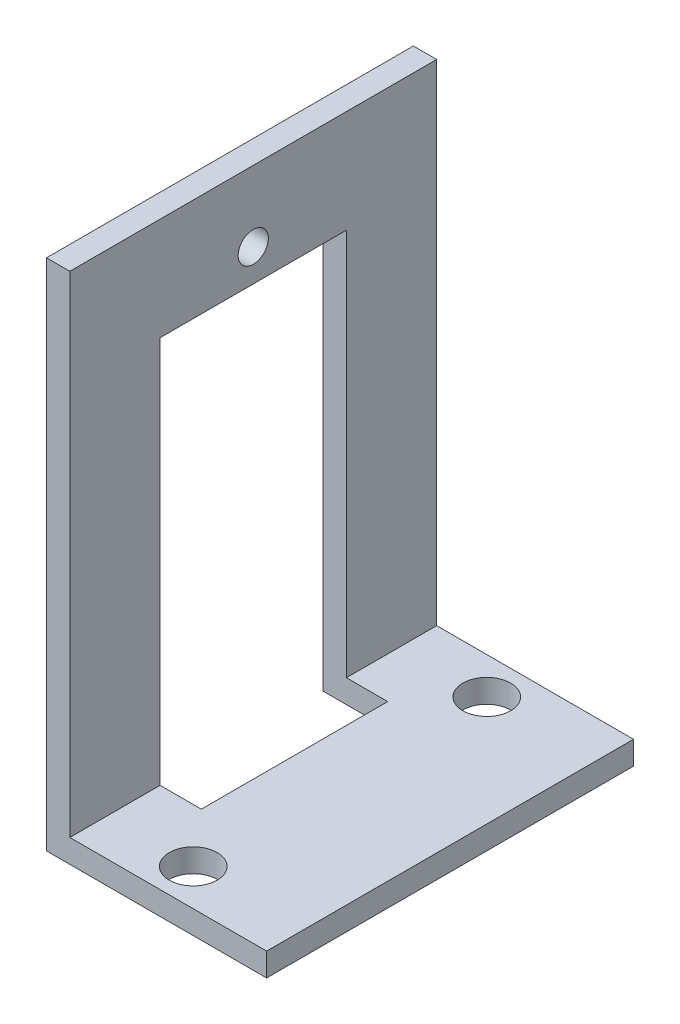
ISO-10303-21;
HEADER;
FILE_DESCRIPTION(('STEP AP214'),'2;1');
FILE_NAME('part.step','',(''),(''),'','','');
FILE_SCHEMA(('AUTOMOTIVE_DESIGN { 1 0 10303 214 1 1 1 1 }'));
ENDSEC;
DATA;
#1=APPLICATION_CONTEXT('core data for automotive mechanical design processes');
#2=APPLICATION_PROTOCOL_DEFINITION('international standard','automotive_design',2000,#1);
#3=PRODUCT_CONTEXT('',#1,'mechanical');
#4=PRODUCT('Part','Part','',(#3));
#5=PRODUCT_RELATED_PRODUCT_CATEGORY('part','',(#4));
#6=PRODUCT_DEFINITION_FORMATION('','',#4);
#7=PRODUCT_DEFINITION_CONTEXT('part definition',#1,'design');
#8=PRODUCT_DEFINITION('design','',#6,#7);
#9=PRODUCT_DEFINITION_SHAPE('','',#8);
#10=(LENGTH_UNIT() NAMED_UNIT(*) SI_UNIT(.MILLI.,.METRE.));
#11=(NAMED_UNIT(*) PLANE_ANGLE_UNIT() SI_UNIT($,.RADIAN.));
#12=(NAMED_UNIT(*) SI_UNIT($,.STERADIAN.) SOLID_ANGLE_UNIT());
#13=UNCERTAINTY_MEASURE_WITH_UNIT(LENGTH_MEASURE(1.E-05),#10,'distance_accuracy_value','');
#14=(GEOMETRIC_REPRESENTATION_CONTEXT(3) GLOBAL_UNCERTAINTY_ASSIGNED_CONTEXT((#13)) GLOBAL_UNIT_ASSIGNED_CONTEXT((#10,
#11,#12)) REPRESENTATION_CONTEXT('',''));
#15=CARTESIAN_POINT('',(0.,0.,0.));
#16=DIRECTION('',(0.,0.,1.));
#17=DIRECTION('',(1.,0.,0.));
#18=AXIS2_PLACEMENT_3D('',#15,#16,#17);
#19=CARTESIAN_POINT('',(15.,1.5875,12.5));
#20=DIRECTION('',(-1.,0.,0.));
#21=DIRECTION('',(0.,0.,1.));
#22=AXIS2_PLACEMENT_3D('',#19,#20,#21);
#23=PLANE('',#22);
#24=DIRECTION('',(0.,1.,0.));
#25=VECTOR('',#24,1.);
#26=CARTESIAN_POINT('',(15.,1.5875,-12.5));
#27=LINE('',#26,#25);
#28=CARTESIAN_POINT('',(15.,0.,-12.5));
#29=VERTEX_POINT('',#28);
#30=CARTESIAN_POINT('',(15.,1.5875,-12.5));
#31=VERTEX_POINT('',#30);
#32=EDGE_CURVE('E179',#29,#31,#27,.T.);
#33=ORIENTED_EDGE('',*,*,#32,.T.);
#34=DIRECTION('',(0.,0.,-1.));
#35=VECTOR('',#34,1.);
#36=CARTESIAN_POINT('',(15.,1.5875,12.5));
#37=LINE('',#36,#35);
#38=CARTESIAN_POINT('',(15.,1.5875,12.5));
#39=VERTEX_POINT('',#38);
#40=EDGE_CURVE('E11',#39,#31,#37,.T.);
#41=ORIENTED_EDGE('',*,*,#40,.F.);
#42=DIRECTION('',(0.,1.,0.));
#43=VECTOR('',#42,1.);
#44=CARTESIAN_POINT('',(15.,1.5875,12.5));
#45=LINE('',#44,#43);
#46=CARTESIAN_POINT('',(15.,0.,12.5));
#47=VERTEX_POINT('',#46);
#48=EDGE_CURVE('E182',#47,#39,#45,.T.);
#49=ORIENTED_EDGE('',*,*,#48,.F.);
#50=DIRECTION('',(0.,0.,-1.));
#51=VECTOR('',#50,1.);
#52=CARTESIAN_POINT('',(15.,0.,12.5));
#53=LINE('',#52,#51);
#54=EDGE_CURVE('E196',#47,#29,#53,.T.);
#55=ORIENTED_EDGE('',*,*,#54,.T.);
#56=EDGE_LOOP('',(#33,#41,#49,#55));
#57=FACE_BOUND('',#56,.T.);
#58=ADVANCED_FACE('F33',(#57),#23,.F.);
#59=CARTESIAN_POINT('',(15.,1.5875,12.5));
#60=DIRECTION('',(0.,-1.,0.));
#61=DIRECTION('',(0.,0.,-1.));
#62=AXIS2_PLACEMENT_3D('',#59,#60,#61);
#63=PLANE('',#62);
#64=DIRECTION('',(0.,0.,-1.));
#65=VECTOR('',#64,1.);
#66=CARTESIAN_POINT('',(1.5875,1.5875,12.5));
#67=LINE('',#66,#65);
#68=CARTESIAN_POINT('',(1.5875,1.5875,-6.35));
#69=VERTEX_POINT('',#68);
#70=CARTESIAN_POINT('',(1.5875,1.5875,-12.5));
#71=VERTEX_POINT('',#70);
#72=EDGE_CURVE('E219',#69,#71,#67,.T.);
#73=ORIENTED_EDGE('',*,*,#72,.F.);
#74=DIRECTION('',(1.,0.,0.));
#75=VECTOR('',#74,1.);
#76=CARTESIAN_POINT('',(15.,1.5875,-6.35));
#77=LINE('',#76,#75);
#78=CARTESIAN_POINT('',(4.4,1.5875,-6.35));
#79=VERTEX_POINT('',#78);
#80=EDGE_CURVE('E157',#69,#79,#77,.T.);
#81=ORIENTED_EDGE('',*,*,#80,.T.);
#82=DIRECTION('',(0.,0.,1.));
#83=VECTOR('',#82,1.);
#84=CARTESIAN_POINT('',(4.4,1.5875,12.5));
#85=LINE('',#84,#83);
#86=CARTESIAN_POINT('',(4.4,1.5875,6.35));
#87=VERTEX_POINT('',#86);
#88=EDGE_CURVE('E148',#79,#87,#85,.T.);
#89=ORIENTED_EDGE('',*,*,#88,.T.);
#90=DIRECTION('',(-1.,0.,0.));
#91=VECTOR('',#90,1.);
#92=CARTESIAN_POINT('',(15.,1.5875,6.35));
#93=LINE('',#92,#91);
#94=CARTESIAN_POINT('',(1.5875,1.5875,6.35));
#95=VERTEX_POINT('',#94);
#96=EDGE_CURVE('E127',#87,#95,#93,.T.);
#97=ORIENTED_EDGE('',*,*,#96,.T.);
#98=CARTESIAN_POINT('',(1.5875,1.5875,12.5));
#99=VERTEX_POINT('',#98);
#100=EDGE_CURVE('E40',#99,#95,#67,.T.);
#101=ORIENTED_EDGE('',*,*,#100,.F.);
#102=DIRECTION('',(-1.,0.,0.));
#103=VECTOR('',#102,1.);
#104=CARTESIAN_POINT('',(15.,1.5875,12.5));
#105=LINE('',#104,#103);
#106=EDGE_CURVE('E185',#39,#99,#105,.T.);
#107=ORIENTED_EDGE('',*,*,#106,.F.);
#108=ORIENTED_EDGE('',*,*,#40,.T.);
#109=DIRECTION('',(-1.,0.,0.));
#110=VECTOR('',#109,1.);
#111=CARTESIAN_POINT('',(15.,1.5875,-12.5));
#112=LINE('',#111,#110);
#113=EDGE_CURVE('E199',#31,#71,#112,.T.);
#114=ORIENTED_EDGE('',*,*,#113,.T.);
#115=EDGE_LOOP('',(#73,#81,#89,#97,#101,#107,#108,#114));
#116=FACE_BOUND('',#115,.T.);
#117=CARTESIAN_POINT('',(7.5,1.5875,-10.));
#118=DIRECTION('',(0.,-1.,0.));
#119=DIRECTION('',(0.,0.,-1.));
#120=AXIS2_PLACEMENT_3D('',#117,#118,#119);
#121=CIRCLE('',#120,1.63194999999999);
#122=CARTESIAN_POINT('',(7.5,1.5875,-11.63195));
#123=VERTEX_POINT('',#122);
#124=EDGE_CURVE('E170',#123,#123,#121,.F.);
#125=ORIENTED_EDGE('',*,*,#124,.F.);
#126=EDGE_LOOP('',(#125));
#127=FACE_BOUND('',#126,.T.);
#128=CARTESIAN_POINT('',(7.5,1.5875,10.));
#129=DIRECTION('',(0.,-1.,0.));
#130=DIRECTION('',(0.,0.,-1.));
#131=AXIS2_PLACEMENT_3D('',#128,#129,#130);
#132=CIRCLE('',#131,1.63194999999999);
#133=CARTESIAN_POINT('',(7.5,1.5875,8.36805000000001));
#134=VERTEX_POINT('',#133);
#135=EDGE_CURVE('E176',#134,#134,#132,.F.);
#136=ORIENTED_EDGE('',*,*,#135,.F.);
#137=EDGE_LOOP('',(#136));
#138=FACE_BOUND('',#137,.T.);
#139=ADVANCED_FACE('F229',(#116,#127,#138),#63,.F.);
#140=CARTESIAN_POINT('',(1.5875,1.5875,12.5));
#141=DIRECTION('',(-1.,0.,0.));
#142=DIRECTION('',(0.,0.,1.));
#143=AXIS2_PLACEMENT_3D('',#140,#141,#142);
#144=PLANE('',#143);
#145=CARTESIAN_POINT('',(1.5875,30.19,0.));
#146=DIRECTION('',(-1.,0.,0.));
#147=DIRECTION('',(0.,0.,1.));
#148=AXIS2_PLACEMENT_3D('',#145,#146,#147);
#149=CIRCLE('',#148,1.0287);
#150=CARTESIAN_POINT('',(1.5875,30.19,1.0287));
#151=VERTEX_POINT('',#150);
#152=EDGE_CURVE('E164',#151,#151,#149,.F.);
#153=ORIENTED_EDGE('',*,*,#152,.F.);
#154=EDGE_LOOP('',(#153));
#155=FACE_BOUND('',#154,.T.);
#156=DIRECTION('',(0.,0.,-1.));
#157=VECTOR('',#156,1.);
#158=CARTESIAN_POINT('',(1.5875,28.,12.5));
#159=LINE('',#158,#157);
#160=CARTESIAN_POINT('',(1.5875,28.,6.35));
#161=VERTEX_POINT('',#160);
#162=CARTESIAN_POINT('',(1.5875,28.,-6.35));
#163=VERTEX_POINT('',#162);
#164=EDGE_CURVE('E160',#161,#163,#159,.T.);
#165=ORIENTED_EDGE('',*,*,#164,.T.);
#166=DIRECTION('',(0.,-1.,0.));
#167=VECTOR('',#166,1.);
#168=CARTESIAN_POINT('',(1.5875,1.5875,-6.35));
#169=LINE('',#168,#167);
#170=EDGE_CURVE('E154',#163,#69,#169,.T.);
#171=ORIENTED_EDGE('',*,*,#170,.T.);
#172=ORIENTED_EDGE('',*,*,#72,.T.);
#173=DIRECTION('',(0.,1.,0.));
#174=VECTOR('',#173,1.);
#175=CARTESIAN_POINT('',(1.5875,1.5875,-12.5));
#176=LINE('',#175,#174);
#177=CARTESIAN_POINT('',(1.5875,35.,-12.5));
#178=VERTEX_POINT('',#177);
#179=EDGE_CURVE('E202',#71,#178,#176,.T.);
#180=ORIENTED_EDGE('',*,*,#179,.T.);
#181=DIRECTION('',(0.,0.,-1.));
#182=VECTOR('',#181,1.);
#183=CARTESIAN_POINT('',(1.5875,35.,12.5));
#184=LINE('',#183,#182);
#185=CARTESIAN_POINT('',(1.5875,35.,12.5));
#186=VERTEX_POINT('',#185);
#187=EDGE_CURVE('E217',#186,#178,#184,.T.);
#188=ORIENTED_EDGE('',*,*,#187,.F.);
#189=DIRECTION('',(0.,1.,0.));
#190=VECTOR('',#189,1.);
#191=CARTESIAN_POINT('',(1.5875,1.5875,12.5));
#192=LINE('',#191,#190);
#193=EDGE_CURVE('E188',#99,#186,#192,.T.);
#194=ORIENTED_EDGE('',*,*,#193,.F.);
#195=ORIENTED_EDGE('',*,*,#100,.T.);
#196=DIRECTION('',(0.,1.,0.));
#197=VECTOR('',#196,1.);
#198=CARTESIAN_POINT('',(1.5875,1.5875,6.35));
#199=LINE('',#198,#197);
#200=EDGE_CURVE('E150',#95,#161,#199,.T.);
#201=ORIENTED_EDGE('',*,*,#200,.T.);
#202=EDGE_LOOP('',(#165,#171,#172,#180,#188,#194,#195,#201));
#203=FACE_BOUND('',#202,.T.);
#204=ADVANCED_FACE('F225',(#155,#203),#144,.F.);
#205=CARTESIAN_POINT('',(0.,35.,12.5));
#206=DIRECTION('',(0.,-1.,0.));
#207=DIRECTION('',(0.,0.,-1.));
#208=AXIS2_PLACEMENT_3D('',#205,#206,#207);
#209=PLANE('',#208);
#210=DIRECTION('',(-1.,0.,0.));
#211=VECTOR('',#210,1.);
#212=CARTESIAN_POINT('',(0.,35.,-12.5));
#213=LINE('',#212,#211);
#214=CARTESIAN_POINT('',(0.,35.,-12.5));
#215=VERTEX_POINT('',#214);
#216=EDGE_CURVE('E204',#178,#215,#213,.T.);
#217=ORIENTED_EDGE('',*,*,#216,.T.);
#218=DIRECTION('',(0.,0.,-1.));
#219=VECTOR('',#218,1.);
#220=CARTESIAN_POINT('',(0.,35.,12.5));
#221=LINE('',#220,#219);
#222=CARTESIAN_POINT('',(0.,35.,12.5));
#223=VERTEX_POINT('',#222);
#224=EDGE_CURVE('E214',#223,#215,#221,.T.);
#225=ORIENTED_EDGE('',*,*,#224,.F.);
#226=DIRECTION('',(-1.,0.,0.));
#227=VECTOR('',#226,1.);
#228=CARTESIAN_POINT('',(0.,35.,12.5));
#229=LINE('',#228,#227);
#230=EDGE_CURVE('E190',#186,#223,#229,.T.);
#231=ORIENTED_EDGE('',*,*,#230,.F.);
#232=ORIENTED_EDGE('',*,*,#187,.T.);
#233=EDGE_LOOP('',(#217,#225,#231,#232));
#234=FACE_BOUND('',#233,.T.);
#235=ADVANCED_FACE('F240',(#234),#209,.F.);
#236=CARTESIAN_POINT('',(0.,0.,12.5));
#237=DIRECTION('',(1.,0.,0.));
#238=DIRECTION('',(0.,0.,-1.));
#239=AXIS2_PLACEMENT_3D('',#236,#237,#238);
#240=PLANE('',#239);
#241=CARTESIAN_POINT('',(0.,30.19,0.));
#242=DIRECTION('',(-1.,0.,0.));
#243=DIRECTION('',(0.,0.,1.));
#244=AXIS2_PLACEMENT_3D('',#241,#242,#243);
#245=CIRCLE('',#244,1.0287);
#246=CARTESIAN_POINT('',(0.,30.19,1.0287));
#247=VERTEX_POINT('',#246);
#248=EDGE_CURVE('E163',#247,#247,#245,.T.);
#249=ORIENTED_EDGE('',*,*,#248,.F.);
#250=EDGE_LOOP('',(#249));
#251=FACE_BOUND('',#250,.T.);
#252=DIRECTION('',(0.,0.,-1.));
#253=VECTOR('',#252,1.);
#254=CARTESIAN_POINT('',(0.,0.,12.5));
#255=LINE('',#254,#253);
#256=CARTESIAN_POINT('',(0.,0.,-6.35));
#257=VERTEX_POINT('',#256);
#258=CARTESIAN_POINT('',(0.,0.,-12.5));
#259=VERTEX_POINT('',#258);
#260=EDGE_CURVE('E212',#257,#259,#255,.T.);
#261=ORIENTED_EDGE('',*,*,#260,.F.);
#262=DIRECTION('',(0.,-1.,0.));
#263=VECTOR('',#262,1.);
#264=CARTESIAN_POINT('',(0.,0.,-6.35));
#265=LINE('',#264,#263);
#266=CARTESIAN_POINT('',(0.,28.,-6.35));
#267=VERTEX_POINT('',#266);
#268=EDGE_CURVE('E257',#267,#257,#265,.T.);
#269=ORIENTED_EDGE('',*,*,#268,.F.);
#270=DIRECTION('',(0.,0.,-1.));
#271=VECTOR('',#270,1.);
#272=CARTESIAN_POINT('',(0.,28.,-6.35));
#273=LINE('',#272,#271);
#274=CARTESIAN_POINT('',(0.,28.,6.35));
#275=VERTEX_POINT('',#274);
#276=EDGE_CURVE('E251',#275,#267,#273,.T.);
#277=ORIENTED_EDGE('',*,*,#276,.F.);
#278=DIRECTION('',(0.,1.,0.));
#279=VECTOR('',#278,1.);
#280=CARTESIAN_POINT('',(0.,0.,6.35));
#281=LINE('',#280,#279);
#282=CARTESIAN_POINT('',(0.,0.,6.35));
#283=VERTEX_POINT('',#282);
#284=EDGE_CURVE('E254',#283,#275,#281,.T.);
#285=ORIENTED_EDGE('',*,*,#284,.F.);
#286=CARTESIAN_POINT('',(0.,0.,12.5));
#287=VERTEX_POINT('',#286);
#288=EDGE_CURVE('E141',#287,#283,#255,.T.);
#289=ORIENTED_EDGE('',*,*,#288,.F.);
#290=DIRECTION('',(0.,-1.,0.));
#291=VECTOR('',#290,1.);
#292=CARTESIAN_POINT('',(0.,0.,12.5));
#293=LINE('',#292,#291);
#294=EDGE_CURVE('E192',#223,#287,#293,.T.);
#295=ORIENTED_EDGE('',*,*,#294,.F.);
#296=ORIENTED_EDGE('',*,*,#224,.T.);
#297=DIRECTION('',(0.,-1.,0.));
#298=VECTOR('',#297,1.);
#299=CARTESIAN_POINT('',(0.,0.,-12.5));
#300=LINE('',#299,#298);
#301=EDGE_CURVE('E206',#215,#259,#300,.T.);
#302=ORIENTED_EDGE('',*,*,#301,.T.);
#303=EDGE_LOOP('',(#261,#269,#277,#285,#289,#295,#296,#302));
#304=FACE_BOUND('',#303,.T.);
#305=ADVANCED_FACE('F245',(#251,#304),#240,.F.);
#306=CARTESIAN_POINT('',(15.,0.,12.5));
#307=DIRECTION('',(0.,1.,0.));
#308=DIRECTION('',(-1.,0.,0.));
#309=AXIS2_PLACEMENT_3D('',#306,#307,#308);
#310=PLANE('',#309);
#311=CARTESIAN_POINT('',(7.5,0.,-10.));
#312=DIRECTION('',(0.,-1.,0.));
#313=DIRECTION('',(0.,0.,-1.));
#314=AXIS2_PLACEMENT_3D('',#311,#312,#313);
#315=CIRCLE('',#314,1.63194999999999);
#316=CARTESIAN_POINT('',(7.5,0.,-11.63195));
#317=VERTEX_POINT('',#316);
#318=EDGE_CURVE('E167',#317,#317,#315,.T.);
#319=ORIENTED_EDGE('',*,*,#318,.F.);
#320=EDGE_LOOP('',(#319));
#321=FACE_BOUND('',#320,.T.);
#322=CARTESIAN_POINT('',(7.5,0.,10.));
#323=DIRECTION('',(0.,-1.,0.));
#324=DIRECTION('',(0.,0.,-1.));
#325=AXIS2_PLACEMENT_3D('',#322,#323,#324);
#326=CIRCLE('',#325,1.63194999999999);
#327=CARTESIAN_POINT('',(7.5,0.,8.36805000000001));
#328=VERTEX_POINT('',#327);
#329=EDGE_CURVE('E173',#328,#328,#326,.T.);
#330=ORIENTED_EDGE('',*,*,#329,.F.);
#331=EDGE_LOOP('',(#330));
#332=FACE_BOUND('',#331,.T.);
#333=DIRECTION('',(0.,0.,1.));
#334=VECTOR('',#333,1.);
#335=CARTESIAN_POINT('',(4.4,0.,-6.35));
#336=LINE('',#335,#334);
#337=CARTESIAN_POINT('',(4.4,0.,-6.35));
#338=VERTEX_POINT('',#337);
#339=CARTESIAN_POINT('',(4.4,0.,6.35));
#340=VERTEX_POINT('',#339);
#341=EDGE_CURVE('E130',#338,#340,#336,.T.);
#342=ORIENTED_EDGE('',*,*,#341,.F.);
#343=DIRECTION('',(-1.,0.,0.));
#344=VECTOR('',#343,1.);
#345=CARTESIAN_POINT('',(4.4,0.,-6.35));
#346=LINE('',#345,#344);
#347=EDGE_CURVE('E55',#338,#257,#346,.T.);
#348=ORIENTED_EDGE('',*,*,#347,.T.);
#349=ORIENTED_EDGE('',*,*,#260,.T.);
#350=DIRECTION('',(1.,0.,0.));
#351=VECTOR('',#350,1.);
#352=CARTESIAN_POINT('',(15.,0.,-12.5));
#353=LINE('',#352,#351);
#354=EDGE_CURVE('E186',#259,#29,#353,.T.);
#355=ORIENTED_EDGE('',*,*,#354,.T.);
#356=ORIENTED_EDGE('',*,*,#54,.F.);
#357=DIRECTION('',(1.,0.,0.));
#358=VECTOR('',#357,1.);
#359=CARTESIAN_POINT('',(15.,0.,12.5));
#360=LINE('',#359,#358);
#361=EDGE_CURVE('E194',#287,#47,#360,.T.);
#362=ORIENTED_EDGE('',*,*,#361,.F.);
#363=ORIENTED_EDGE('',*,*,#288,.T.);
#364=DIRECTION('',(-1.,0.,0.));
#365=VECTOR('',#364,1.);
#366=CARTESIAN_POINT('',(4.4,0.,6.35));
#367=LINE('',#366,#365);
#368=EDGE_CURVE('E124',#340,#283,#367,.T.);
#369=ORIENTED_EDGE('',*,*,#368,.F.);
#370=EDGE_LOOP('',(#342,#348,#349,#355,#356,#362,#363,#369));
#371=FACE_BOUND('',#370,.T.);
#372=ADVANCED_FACE('F138',(#321,#332,#371),#310,.F.);
#373=CARTESIAN_POINT('',(0.,0.,12.5));
#374=DIRECTION('',(0.,0.,-1.));
#375=DIRECTION('',(-1.,0.,0.));
#376=AXIS2_PLACEMENT_3D('',#373,#374,#375);
#377=PLANE('',#376);
#378=ORIENTED_EDGE('',*,*,#48,.T.);
#379=ORIENTED_EDGE('',*,*,#106,.T.);
#380=ORIENTED_EDGE('',*,*,#193,.T.);
#381=ORIENTED_EDGE('',*,*,#230,.T.);
#382=ORIENTED_EDGE('',*,*,#294,.T.);
#383=ORIENTED_EDGE('',*,*,#361,.T.);
#384=EDGE_LOOP('',(#378,#379,#380,#381,#382,#383));
#385=FACE_BOUND('',#384,.T.);
#386=ADVANCED_FACE('F247',(#385),#377,.F.);
#387=CARTESIAN_POINT('',(0.,0.,-12.5));
#388=DIRECTION('',(0.,0.,-1.));
#389=DIRECTION('',(-1.,0.,0.));
#390=AXIS2_PLACEMENT_3D('',#387,#388,#389);
#391=PLANE('',#390);
#392=ORIENTED_EDGE('',*,*,#32,.F.);
#393=ORIENTED_EDGE('',*,*,#354,.F.);
#394=ORIENTED_EDGE('',*,*,#301,.F.);
#395=ORIENTED_EDGE('',*,*,#216,.F.);
#396=ORIENTED_EDGE('',*,*,#179,.F.);
#397=ORIENTED_EDGE('',*,*,#113,.F.);
#398=EDGE_LOOP('',(#392,#393,#394,#395,#396,#397));
#399=FACE_BOUND('',#398,.T.);
#400=ADVANCED_FACE('F235',(#399),#391,.T.);
#401=CARTESIAN_POINT('',(7.5,0.,10.));
#402=DIRECTION('',(0.,-1.,0.));
#403=DIRECTION('',(0.,0.,-1.));
#404=AXIS2_PLACEMENT_3D('',#401,#402,#403);
#405=CYLINDRICAL_SURFACE('',#404,1.63194999999999);
#406=ORIENTED_EDGE('',*,*,#135,.T.);
#407=EDGE_LOOP('',(#406));
#408=FACE_BOUND('',#407,.T.);
#409=ORIENTED_EDGE('',*,*,#329,.T.);
#410=EDGE_LOOP('',(#409));
#411=FACE_BOUND('',#410,.T.);
#412=ADVANCED_FACE('F285',(#408,#411),#405,.F.);
#413=CARTESIAN_POINT('',(7.5,0.,-10.));
#414=DIRECTION('',(0.,-1.,0.));
#415=DIRECTION('',(0.,0.,-1.));
#416=AXIS2_PLACEMENT_3D('',#413,#414,#415);
#417=CYLINDRICAL_SURFACE('',#416,1.63194999999999);
#418=ORIENTED_EDGE('',*,*,#124,.T.);
#419=EDGE_LOOP('',(#418));
#420=FACE_BOUND('',#419,.T.);
#421=ORIENTED_EDGE('',*,*,#318,.T.);
#422=EDGE_LOOP('',(#421));
#423=FACE_BOUND('',#422,.T.);
#424=ADVANCED_FACE('F290',(#420,#423),#417,.F.);
#425=CARTESIAN_POINT('',(0.,30.19,0.));
#426=DIRECTION('',(-1.,0.,0.));
#427=DIRECTION('',(0.,0.,1.));
#428=AXIS2_PLACEMENT_3D('',#425,#426,#427);
#429=CYLINDRICAL_SURFACE('',#428,1.0287);
#430=ORIENTED_EDGE('',*,*,#152,.T.);
#431=EDGE_LOOP('',(#430));
#432=FACE_BOUND('',#431,.T.);
#433=ORIENTED_EDGE('',*,*,#248,.T.);
#434=EDGE_LOOP('',(#433));
#435=FACE_BOUND('',#434,.T.);
#436=ADVANCED_FACE('F294',(#432,#435),#429,.F.);
#437=CARTESIAN_POINT('',(4.4,28.,-6.35));
#438=DIRECTION('',(0.,1.,0.));
#439=DIRECTION('',(0.,0.,1.));
#440=AXIS2_PLACEMENT_3D('',#437,#438,#439);
#441=PLANE('',#440);
#442=DIRECTION('',(-1.,0.,0.));
#443=VECTOR('',#442,1.);
#444=CARTESIAN_POINT('',(4.4,28.,6.35));
#445=LINE('',#444,#443);
#446=EDGE_CURVE('E47',#161,#275,#445,.T.);
#447=ORIENTED_EDGE('',*,*,#446,.T.);
#448=ORIENTED_EDGE('',*,*,#276,.T.);
#449=DIRECTION('',(-1.,0.,0.));
#450=VECTOR('',#449,1.);
#451=CARTESIAN_POINT('',(4.4,28.,-6.35));
#452=LINE('',#451,#450);
#453=EDGE_CURVE('E143',#163,#267,#452,.T.);
#454=ORIENTED_EDGE('',*,*,#453,.F.);
#455=ORIENTED_EDGE('',*,*,#164,.F.);
#456=EDGE_LOOP('',(#447,#448,#454,#455));
#457=FACE_BOUND('',#456,.T.);
#458=ADVANCED_FACE('F263',(#457),#441,.F.);
#459=CARTESIAN_POINT('',(4.4,0.,-6.35));
#460=DIRECTION('',(0.,0.,-1.));
#461=DIRECTION('',(-1.,0.,0.));
#462=AXIS2_PLACEMENT_3D('',#459,#460,#461);
#463=PLANE('',#462);
#464=ORIENTED_EDGE('',*,*,#170,.F.);
#465=ORIENTED_EDGE('',*,*,#453,.T.);
#466=ORIENTED_EDGE('',*,*,#268,.T.);
#467=ORIENTED_EDGE('',*,*,#347,.F.);
#468=DIRECTION('',(0.,-1.,0.));
#469=VECTOR('',#468,1.);
#470=CARTESIAN_POINT('',(4.4,0.,-6.35));
#471=LINE('',#470,#469);
#472=EDGE_CURVE('E134',#79,#338,#471,.T.);
#473=ORIENTED_EDGE('',*,*,#472,.F.);
#474=ORIENTED_EDGE('',*,*,#80,.F.);
#475=EDGE_LOOP('',(#464,#465,#466,#467,#473,#474));
#476=FACE_BOUND('',#475,.T.);
#477=ADVANCED_FACE('F250',(#476),#463,.F.);
#478=CARTESIAN_POINT('',(4.4,0.,6.35));
#479=DIRECTION('',(0.,0.,1.));
#480=DIRECTION('',(0.,-1.,0.));
#481=AXIS2_PLACEMENT_3D('',#478,#479,#480);
#482=PLANE('',#481);
#483=DIRECTION('',(0.,1.,0.));
#484=VECTOR('',#483,1.);
#485=CARTESIAN_POINT('',(4.4,0.,6.35));
#486=LINE('',#485,#484);
#487=EDGE_CURVE('E120',#340,#87,#486,.T.);
#488=ORIENTED_EDGE('',*,*,#487,.F.);
#489=ORIENTED_EDGE('',*,*,#368,.T.);
#490=ORIENTED_EDGE('',*,*,#284,.T.);
#491=ORIENTED_EDGE('',*,*,#446,.F.);
#492=ORIENTED_EDGE('',*,*,#200,.F.);
#493=ORIENTED_EDGE('',*,*,#96,.F.);
#494=EDGE_LOOP('',(#488,#489,#490,#491,#492,#493));
#495=FACE_BOUND('',#494,.T.);
#496=ADVANCED_FACE('F122',(#495),#482,.F.);
#497=CARTESIAN_POINT('',(4.4,0.,0.));
#498=DIRECTION('',(1.,0.,0.));
#499=DIRECTION('',(0.,0.,-1.));
#500=AXIS2_PLACEMENT_3D('',#497,#498,#499);
#501=PLANE('',#500);
#502=ORIENTED_EDGE('',*,*,#472,.T.);
#503=ORIENTED_EDGE('',*,*,#341,.T.);
#504=ORIENTED_EDGE('',*,*,#487,.T.);
#505=ORIENTED_EDGE('',*,*,#88,.F.);
#506=EDGE_LOOP('',(#502,#503,#504,#505));
#507=FACE_BOUND('',#506,.T.);
#508=ADVANCED_FACE('F133',(#507),#501,.F.);
#509=CLOSED_SHELL('',(#58,#139,#204,#235,#305,#372,#386,#400,#412,#424,#436,#458,#477,#496,#508));
#510=MANIFOLD_SOLID_BREP('B2',#509);
#511=ADVANCED_BREP_SHAPE_REPRESENTATION('',(#18,#510),#14);
#512=SHAPE_DEFINITION_REPRESENTATION(#9,#511);
ENDSEC;
END-ISO-10303-21;
